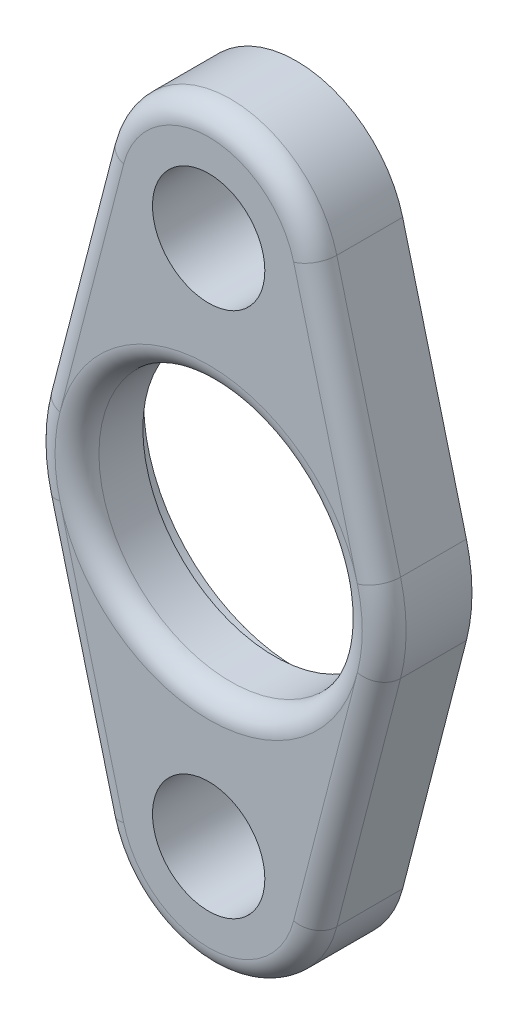
ISO-10303-21;
HEADER;
FILE_DESCRIPTION(('STEP AP214'),'2;1');
FILE_NAME('part.step','',(''),(''),'','','');
FILE_SCHEMA(('AUTOMOTIVE_DESIGN { 1 0 10303 214 1 1 1 1 }'));
ENDSEC;
DATA;
#1=APPLICATION_CONTEXT('core data for automotive mechanical design processes');
#2=APPLICATION_PROTOCOL_DEFINITION('international standard','automotive_design',2000,#1);
#3=PRODUCT_CONTEXT('',#1,'mechanical');
#4=PRODUCT('Part','Part','',(#3));
#5=PRODUCT_RELATED_PRODUCT_CATEGORY('part','',(#4));
#6=PRODUCT_DEFINITION_FORMATION('','',#4);
#7=PRODUCT_DEFINITION_CONTEXT('part definition',#1,'design');
#8=PRODUCT_DEFINITION('design','',#6,#7);
#9=PRODUCT_DEFINITION_SHAPE('','',#8);
#10=(LENGTH_UNIT() NAMED_UNIT(*) SI_UNIT(.MILLI.,.METRE.));
#11=(NAMED_UNIT(*) PLANE_ANGLE_UNIT() SI_UNIT($,.RADIAN.));
#12=(NAMED_UNIT(*) SI_UNIT($,.STERADIAN.) SOLID_ANGLE_UNIT());
#13=UNCERTAINTY_MEASURE_WITH_UNIT(LENGTH_MEASURE(1.E-05),#10,'distance_accuracy_value','');
#14=(GEOMETRIC_REPRESENTATION_CONTEXT(3) GLOBAL_UNCERTAINTY_ASSIGNED_CONTEXT((#13)) GLOBAL_UNIT_ASSIGNED_CONTEXT((#10,
#11,#12)) REPRESENTATION_CONTEXT('',''));
#15=CARTESIAN_POINT('',(0.,0.,0.));
#16=DIRECTION('',(0.,0.,1.));
#17=DIRECTION('',(1.,0.,0.));
#18=AXIS2_PLACEMENT_3D('',#15,#16,#17);
#19=CARTESIAN_POINT('',(0.,-9.525,3.175));
#20=DIRECTION('',(0.,0.,1.));
#21=DIRECTION('',(1.,0.,0.));
#22=AXIS2_PLACEMENT_3D('',#19,#20,#21);
#23=PLANE('',#22);
#24=CARTESIAN_POINT('',(0.,-9.525,3.175));
#25=DIRECTION('',(0.,0.,1.));
#26=DIRECTION('',(1.,0.,0.));
#27=AXIS2_PLACEMENT_3D('',#24,#25,#26);
#28=CIRCLE('',#27,3.175);
#29=CARTESIAN_POINT('',(-3.07418053105214,-10.31875,3.175));
#30=VERTEX_POINT('',#29);
#31=CARTESIAN_POINT('',(3.07418053105214,-10.31875,3.175));
#32=VERTEX_POINT('',#31);
#33=EDGE_CURVE('E215',#30,#32,#28,.T.);
#34=ORIENTED_EDGE('',*,*,#33,.T.);
#35=DIRECTION('',(0.25,0.968245836551854,0.));
#36=VECTOR('',#35,1.);
#37=CARTESIAN_POINT('',(5.37981592934124,-1.3890625,3.175));
#38=LINE('',#37,#36);
#39=CARTESIAN_POINT('',(5.37981592934124,-1.3890625,3.175));
#40=VERTEX_POINT('',#39);
#41=EDGE_CURVE('E212',#32,#40,#38,.T.);
#42=ORIENTED_EDGE('',*,*,#41,.T.);
#43=CARTESIAN_POINT('',(0.,0.,3.175));
#44=DIRECTION('',(0.,0.,1.));
#45=DIRECTION('',(1.,0.,0.));
#46=AXIS2_PLACEMENT_3D('',#43,#44,#45);
#47=CIRCLE('',#46,5.55625);
#48=CARTESIAN_POINT('',(-5.37981592934124,-1.3890625,3.175));
#49=VERTEX_POINT('',#48);
#50=EDGE_CURVE('E208',#40,#49,#47,.F.);
#51=ORIENTED_EDGE('',*,*,#50,.T.);
#52=DIRECTION('',(0.25,-0.968245836551854,0.));
#53=VECTOR('',#52,1.);
#54=CARTESIAN_POINT('',(-3.07418053105214,-10.31875,3.175));
#55=LINE('',#54,#53);
#56=EDGE_CURVE('E209',#49,#30,#55,.T.);
#57=ORIENTED_EDGE('',*,*,#56,.T.);
#58=EDGE_LOOP('',(#34,#42,#51,#57));
#59=FACE_BOUND('',#58,.T.);
#60=CARTESIAN_POINT('',(0.,-9.525,3.175));
#61=DIRECTION('',(0.,0.,1.));
#62=DIRECTION('',(1.,0.,0.));
#63=AXIS2_PLACEMENT_3D('',#60,#61,#62);
#64=CIRCLE('',#63,2.032);
#65=CARTESIAN_POINT('',(2.032,-9.525,3.175));
#66=VERTEX_POINT('',#65);
#67=EDGE_CURVE('E270',#66,#66,#64,.T.);
#68=ORIENTED_EDGE('',*,*,#67,.F.);
#69=EDGE_LOOP('',(#68));
#70=FACE_BOUND('',#69,.T.);
#71=ADVANCED_FACE('F39',(#59,#70),#23,.T.);
#72=CARTESIAN_POINT('',(0.,0.,3.175));
#73=DIRECTION('',(0.,0.,-1.));
#74=DIRECTION('',(-1.,0.,0.));
#75=AXIS2_PLACEMENT_3D('',#72,#73,#74);
#76=CYLINDRICAL_SURFACE('',#75,4.7625);
#77=CARTESIAN_POINT('',(0.,0.,2.38125));
#78=DIRECTION('',(0.,0.,1.));
#79=DIRECTION('',(1.,0.,0.));
#80=AXIS2_PLACEMENT_3D('',#77,#78,#79);
#81=CIRCLE('',#80,4.7625);
#82=CARTESIAN_POINT('',(4.7625,0.,2.38125));
#83=VERTEX_POINT('',#82);
#84=EDGE_CURVE('E48',#83,#83,#81,.T.);
#85=ORIENTED_EDGE('',*,*,#84,.T.);
#86=EDGE_LOOP('',(#85));
#87=FACE_BOUND('',#86,.T.);
#88=CARTESIAN_POINT('',(0.,0.,0.79375));
#89=DIRECTION('',(0.,0.,-1.));
#90=DIRECTION('',(-1.,0.,0.));
#91=AXIS2_PLACEMENT_3D('',#88,#89,#90);
#92=CIRCLE('',#91,4.7625);
#93=CARTESIAN_POINT('',(-4.7625,0.,0.79375));
#94=VERTEX_POINT('',#93);
#95=EDGE_CURVE('E194',#94,#94,#92,.T.);
#96=ORIENTED_EDGE('',*,*,#95,.T.);
#97=EDGE_LOOP('',(#96));
#98=FACE_BOUND('',#97,.T.);
#99=ADVANCED_FACE('F291',(#87,#98),#76,.F.);
#100=CARTESIAN_POINT('',(0.,9.525,3.175));
#101=DIRECTION('',(0.,0.,1.));
#102=DIRECTION('',(1.,0.,0.));
#103=AXIS2_PLACEMENT_3D('',#100,#101,#102);
#104=CIRCLE('',#103,3.175);
#105=CARTESIAN_POINT('',(3.07418053105214,10.31875,3.175));
#106=VERTEX_POINT('',#105);
#107=CARTESIAN_POINT('',(-3.07418053105214,10.31875,3.175));
#108=VERTEX_POINT('',#107);
#109=EDGE_CURVE('E201',#106,#108,#104,.T.);
#110=ORIENTED_EDGE('',*,*,#109,.T.);
#111=DIRECTION('',(-0.25,-0.968245836551854,0.));
#112=VECTOR('',#111,1.);
#113=CARTESIAN_POINT('',(-5.37981592934124,1.3890625,3.175));
#114=LINE('',#113,#112);
#115=CARTESIAN_POINT('',(-5.37981592934124,1.3890625,3.175));
#116=VERTEX_POINT('',#115);
#117=EDGE_CURVE('E202',#108,#116,#114,.T.);
#118=ORIENTED_EDGE('',*,*,#117,.T.);
#119=CARTESIAN_POINT('',(0.,0.,3.175));
#120=DIRECTION('',(0.,0.,1.));
#121=DIRECTION('',(1.,0.,0.));
#122=AXIS2_PLACEMENT_3D('',#119,#120,#121);
#123=CIRCLE('',#122,5.55625);
#124=CARTESIAN_POINT('',(5.37981592934124,1.3890625,3.175));
#125=VERTEX_POINT('',#124);
#126=EDGE_CURVE('E203',#116,#125,#123,.F.);
#127=ORIENTED_EDGE('',*,*,#126,.T.);
#128=DIRECTION('',(-0.25,0.968245836551854,0.));
#129=VECTOR('',#128,1.);
#130=CARTESIAN_POINT('',(3.07418053105214,10.31875,3.175));
#131=LINE('',#130,#129);
#132=EDGE_CURVE('E200',#125,#106,#131,.T.);
#133=ORIENTED_EDGE('',*,*,#132,.T.);
#134=EDGE_LOOP('',(#110,#118,#127,#133));
#135=FACE_BOUND('',#134,.T.);
#136=CARTESIAN_POINT('',(0.,9.525,3.175));
#137=DIRECTION('',(0.,0.,1.));
#138=DIRECTION('',(1.,0.,0.));
#139=AXIS2_PLACEMENT_3D('',#136,#137,#138);
#140=CIRCLE('',#139,2.032);
#141=CARTESIAN_POINT('',(2.032,9.525,3.175));
#142=VERTEX_POINT('',#141);
#143=EDGE_CURVE('E158',#142,#142,#140,.T.);
#144=ORIENTED_EDGE('',*,*,#143,.F.);
#145=EDGE_LOOP('',(#144));
#146=FACE_BOUND('',#145,.T.);
#147=ADVANCED_FACE('F296',(#135,#146),#23,.T.);
#148=CARTESIAN_POINT('',(0.,-9.525,0.));
#149=DIRECTION('',(0.,0.,1.));
#150=DIRECTION('',(1.,0.,0.));
#151=AXIS2_PLACEMENT_3D('',#148,#149,#150);
#152=PLANE('',#151);
#153=CARTESIAN_POINT('',(0.,0.,0.));
#154=DIRECTION('',(0.,0.,-1.));
#155=DIRECTION('',(-1.,0.,0.));
#156=AXIS2_PLACEMENT_3D('',#153,#154,#155);
#157=CIRCLE('',#156,5.5245);
#158=CARTESIAN_POINT('',(-5.5245,0.,0.));
#159=VERTEX_POINT('',#158);
#160=EDGE_CURVE('E258',#159,#159,#157,.T.);
#161=ORIENTED_EDGE('',*,*,#160,.F.);
#162=EDGE_LOOP('',(#161));
#163=FACE_BOUND('',#162,.T.);
#164=CARTESIAN_POINT('',(0.,-9.525,0.));
#165=DIRECTION('',(0.,0.,1.));
#166=DIRECTION('',(1.,0.,0.));
#167=AXIS2_PLACEMENT_3D('',#164,#165,#166);
#168=CIRCLE('',#167,3.96875);
#169=CARTESIAN_POINT('',(-3.84272566381517,-10.5171875,0.));
#170=VERTEX_POINT('',#169);
#171=CARTESIAN_POINT('',(3.84272566381517,-10.5171875,0.));
#172=VERTEX_POINT('',#171);
#173=EDGE_CURVE('E149',#170,#172,#168,.T.);
#174=ORIENTED_EDGE('',*,*,#173,.F.);
#175=DIRECTION('',(0.25,-0.968245836551854,0.));
#176=VECTOR('',#175,1.);
#177=CARTESIAN_POINT('',(-6.14836106210427,-1.5875,0.));
#178=LINE('',#177,#176);
#179=CARTESIAN_POINT('',(-6.14836106210427,-1.5875,0.));
#180=VERTEX_POINT('',#179);
#181=EDGE_CURVE('E180',#180,#170,#178,.T.);
#182=ORIENTED_EDGE('',*,*,#181,.F.);
#183=CARTESIAN_POINT('',(0.,0.,0.));
#184=DIRECTION('',(0.,0.,1.));
#185=DIRECTION('',(1.,0.,0.));
#186=AXIS2_PLACEMENT_3D('',#183,#184,#185);
#187=CIRCLE('',#186,6.35);
#188=CARTESIAN_POINT('',(-6.14836106210428,1.5875,0.));
#189=VERTEX_POINT('',#188);
#190=EDGE_CURVE('E174',#189,#180,#187,.T.);
#191=ORIENTED_EDGE('',*,*,#190,.F.);
#192=DIRECTION('',(-0.25,-0.968245836551854,0.));
#193=VECTOR('',#192,1.);
#194=CARTESIAN_POINT('',(-3.84272566381517,10.5171875,0.));
#195=LINE('',#194,#193);
#196=CARTESIAN_POINT('',(-3.84272566381517,10.5171875,0.));
#197=VERTEX_POINT('',#196);
#198=EDGE_CURVE('E175',#197,#189,#195,.T.);
#199=ORIENTED_EDGE('',*,*,#198,.F.);
#200=CARTESIAN_POINT('',(0.,9.525,0.));
#201=DIRECTION('',(0.,0.,1.));
#202=DIRECTION('',(1.,0.,0.));
#203=AXIS2_PLACEMENT_3D('',#200,#201,#202);
#204=CIRCLE('',#203,3.96875);
#205=CARTESIAN_POINT('',(3.84272566381517,10.5171875,0.));
#206=VERTEX_POINT('',#205);
#207=EDGE_CURVE('E166',#206,#197,#204,.T.);
#208=ORIENTED_EDGE('',*,*,#207,.F.);
#209=DIRECTION('',(-0.25,0.968245836551854,0.));
#210=VECTOR('',#209,1.);
#211=CARTESIAN_POINT('',(6.14836106210428,1.5875,0.));
#212=LINE('',#211,#210);
#213=CARTESIAN_POINT('',(6.14836106210428,1.5875,0.));
#214=VERTEX_POINT('',#213);
#215=EDGE_CURVE('E167',#214,#206,#212,.T.);
#216=ORIENTED_EDGE('',*,*,#215,.F.);
#217=CARTESIAN_POINT('',(0.,0.,0.));
#218=DIRECTION('',(0.,0.,1.));
#219=DIRECTION('',(1.,0.,0.));
#220=AXIS2_PLACEMENT_3D('',#217,#218,#219);
#221=CIRCLE('',#220,6.35);
#222=CARTESIAN_POINT('',(6.14836106210428,-1.5875,0.));
#223=VERTEX_POINT('',#222);
#224=EDGE_CURVE('E155',#223,#214,#221,.T.);
#225=ORIENTED_EDGE('',*,*,#224,.F.);
#226=DIRECTION('',(0.25,0.968245836551854,0.));
#227=VECTOR('',#226,1.);
#228=CARTESIAN_POINT('',(3.84272566381517,-10.5171875,0.));
#229=LINE('',#228,#227);
#230=EDGE_CURVE('E133',#172,#223,#229,.T.);
#231=ORIENTED_EDGE('',*,*,#230,.F.);
#232=EDGE_LOOP('',(#174,#182,#191,#199,#208,#216,#225,#231));
#233=FACE_BOUND('',#232,.T.);
#234=CARTESIAN_POINT('',(0.,9.525,0.));
#235=DIRECTION('',(0.,0.,1.));
#236=DIRECTION('',(1.,0.,0.));
#237=AXIS2_PLACEMENT_3D('',#234,#235,#236);
#238=CIRCLE('',#237,2.032);
#239=CARTESIAN_POINT('',(2.032,9.525,0.));
#240=VERTEX_POINT('',#239);
#241=EDGE_CURVE('E161',#240,#240,#238,.T.);
#242=ORIENTED_EDGE('',*,*,#241,.T.);
#243=EDGE_LOOP('',(#242));
#244=FACE_BOUND('',#243,.T.);
#245=CARTESIAN_POINT('',(0.,-9.525,0.));
#246=DIRECTION('',(0.,0.,1.));
#247=DIRECTION('',(1.,0.,0.));
#248=AXIS2_PLACEMENT_3D('',#245,#246,#247);
#249=CIRCLE('',#248,2.032);
#250=CARTESIAN_POINT('',(2.032,-9.525,0.));
#251=VERTEX_POINT('',#250);
#252=EDGE_CURVE('E193',#251,#251,#249,.T.);
#253=ORIENTED_EDGE('',*,*,#252,.T.);
#254=EDGE_LOOP('',(#253));
#255=FACE_BOUND('',#254,.T.);
#256=ADVANCED_FACE('F148',(#163,#233,#244,#255),#152,.F.);
#257=CARTESIAN_POINT('',(0.,-9.525,3.175));
#258=DIRECTION('',(0.,0.,-1.));
#259=DIRECTION('',(-1.,0.,0.));
#260=AXIS2_PLACEMENT_3D('',#257,#258,#259);
#261=CYLINDRICAL_SURFACE('',#260,3.96875);
#262=DIRECTION('',(0.,0.,-1.));
#263=VECTOR('',#262,1.);
#264=CARTESIAN_POINT('',(3.84272566381517,-10.5171875,3.175));
#265=LINE('',#264,#263);
#266=CARTESIAN_POINT('',(3.84272566381517,-10.5171875,2.38125));
#267=VERTEX_POINT('',#266);
#268=EDGE_CURVE('E128',#267,#172,#265,.T.);
#269=ORIENTED_EDGE('',*,*,#268,.F.);
#270=CARTESIAN_POINT('',(0.,-9.525,2.38125));
#271=DIRECTION('',(0.,0.,1.));
#272=DIRECTION('',(1.,0.,0.));
#273=AXIS2_PLACEMENT_3D('',#270,#271,#272);
#274=CIRCLE('',#273,3.96875);
#275=CARTESIAN_POINT('',(-3.84272566381517,-10.5171875,2.38125));
#276=VERTEX_POINT('',#275);
#277=EDGE_CURVE('E217',#267,#276,#274,.F.);
#278=ORIENTED_EDGE('',*,*,#277,.T.);
#279=DIRECTION('',(0.,0.,-1.));
#280=VECTOR('',#279,1.);
#281=CARTESIAN_POINT('',(-3.84272566381517,-10.5171875,3.175));
#282=LINE('',#281,#280);
#283=EDGE_CURVE('E156',#276,#170,#282,.T.);
#284=ORIENTED_EDGE('',*,*,#283,.T.);
#285=ORIENTED_EDGE('',*,*,#173,.T.);
#286=EDGE_LOOP('',(#269,#278,#284,#285));
#287=FACE_BOUND('',#286,.T.);
#288=ADVANCED_FACE('F152',(#287),#261,.T.);
#289=CARTESIAN_POINT('',(3.84272566381517,-10.5171875,3.175));
#290=DIRECTION('',(-0.968245836551854,0.25,0.));
#291=DIRECTION('',(-0.25,-0.968245836551854,0.));
#292=AXIS2_PLACEMENT_3D('',#289,#290,#291);
#293=PLANE('',#292);
#294=DIRECTION('',(0.,0.,-1.));
#295=VECTOR('',#294,1.);
#296=CARTESIAN_POINT('',(6.14836106210428,-1.5875,3.175));
#297=LINE('',#296,#295);
#298=CARTESIAN_POINT('',(6.14836106210428,-1.5875,2.38125));
#299=VERTEX_POINT('',#298);
#300=EDGE_CURVE('E142',#299,#223,#297,.T.);
#301=ORIENTED_EDGE('',*,*,#300,.F.);
#302=DIRECTION('',(0.25,0.968245836551854,0.));
#303=VECTOR('',#302,1.);
#304=CARTESIAN_POINT('',(3.84272566381517,-10.5171875,2.38125));
#305=LINE('',#304,#303);
#306=EDGE_CURVE('E139',#299,#267,#305,.F.);
#307=ORIENTED_EDGE('',*,*,#306,.T.);
#308=ORIENTED_EDGE('',*,*,#268,.T.);
#309=ORIENTED_EDGE('',*,*,#230,.T.);
#310=EDGE_LOOP('',(#301,#307,#308,#309));
#311=FACE_BOUND('',#310,.T.);
#312=ADVANCED_FACE('F132',(#311),#293,.F.);
#313=CARTESIAN_POINT('',(0.,0.,3.175));
#314=DIRECTION('',(0.,0.,-1.));
#315=DIRECTION('',(-1.,0.,0.));
#316=AXIS2_PLACEMENT_3D('',#313,#314,#315);
#317=CYLINDRICAL_SURFACE('',#316,6.35);
#318=DIRECTION('',(0.,0.,-1.));
#319=VECTOR('',#318,1.);
#320=CARTESIAN_POINT('',(6.14836106210428,1.5875,3.175));
#321=LINE('',#320,#319);
#322=CARTESIAN_POINT('',(6.14836106210428,1.5875,2.38125));
#323=VERTEX_POINT('',#322);
#324=EDGE_CURVE('E188',#323,#214,#321,.T.);
#325=ORIENTED_EDGE('',*,*,#324,.F.);
#326=CARTESIAN_POINT('',(0.,0.,2.38125));
#327=DIRECTION('',(0.,0.,1.));
#328=DIRECTION('',(1.,0.,0.));
#329=AXIS2_PLACEMENT_3D('',#326,#327,#328);
#330=CIRCLE('',#329,6.35);
#331=EDGE_CURVE('E143',#323,#299,#330,.F.);
#332=ORIENTED_EDGE('',*,*,#331,.T.);
#333=ORIENTED_EDGE('',*,*,#300,.T.);
#334=ORIENTED_EDGE('',*,*,#224,.T.);
#335=EDGE_LOOP('',(#325,#332,#333,#334));
#336=FACE_BOUND('',#335,.T.);
#337=ADVANCED_FACE('F331',(#336),#317,.T.);
#338=CARTESIAN_POINT('',(6.14836106210428,1.5875,3.175));
#339=DIRECTION('',(-0.968245836551854,-0.25,0.));
#340=DIRECTION('',(0.25,-0.968245836551854,0.));
#341=AXIS2_PLACEMENT_3D('',#338,#339,#340);
#342=PLANE('',#341);
#343=DIRECTION('',(0.,0.,-1.));
#344=VECTOR('',#343,1.);
#345=CARTESIAN_POINT('',(3.84272566381517,10.5171875,3.175));
#346=LINE('',#345,#344);
#347=CARTESIAN_POINT('',(3.84272566381517,10.5171875,2.38125));
#348=VERTEX_POINT('',#347);
#349=EDGE_CURVE('E190',#348,#206,#346,.T.);
#350=ORIENTED_EDGE('',*,*,#349,.F.);
#351=DIRECTION('',(-0.25,0.968245836551854,0.));
#352=VECTOR('',#351,1.);
#353=CARTESIAN_POINT('',(6.14836106210428,1.5875,2.38125));
#354=LINE('',#353,#352);
#355=EDGE_CURVE('E11',#348,#323,#354,.F.);
#356=ORIENTED_EDGE('',*,*,#355,.T.);
#357=ORIENTED_EDGE('',*,*,#324,.T.);
#358=ORIENTED_EDGE('',*,*,#215,.T.);
#359=EDGE_LOOP('',(#350,#356,#357,#358));
#360=FACE_BOUND('',#359,.T.);
#361=ADVANCED_FACE('F332',(#360),#342,.F.);
#362=CARTESIAN_POINT('',(0.,9.525,3.175));
#363=DIRECTION('',(0.,0.,-1.));
#364=DIRECTION('',(-1.,0.,0.));
#365=AXIS2_PLACEMENT_3D('',#362,#363,#364);
#366=CYLINDRICAL_SURFACE('',#365,3.96875);
#367=DIRECTION('',(0.,0.,-1.));
#368=VECTOR('',#367,1.);
#369=CARTESIAN_POINT('',(-3.84272566381517,10.5171875,3.175));
#370=LINE('',#369,#368);
#371=CARTESIAN_POINT('',(-3.84272566381517,10.5171875,2.38125));
#372=VERTEX_POINT('',#371);
#373=EDGE_CURVE('E183',#372,#197,#370,.T.);
#374=ORIENTED_EDGE('',*,*,#373,.F.);
#375=CARTESIAN_POINT('',(0.,9.525,2.38125));
#376=DIRECTION('',(0.,0.,1.));
#377=DIRECTION('',(1.,0.,0.));
#378=AXIS2_PLACEMENT_3D('',#375,#376,#377);
#379=CIRCLE('',#378,3.96875);
#380=EDGE_CURVE('E57',#372,#348,#379,.F.);
#381=ORIENTED_EDGE('',*,*,#380,.T.);
#382=ORIENTED_EDGE('',*,*,#349,.T.);
#383=ORIENTED_EDGE('',*,*,#207,.T.);
#384=EDGE_LOOP('',(#374,#381,#382,#383));
#385=FACE_BOUND('',#384,.T.);
#386=ADVANCED_FACE('F359',(#385),#366,.T.);
#387=CARTESIAN_POINT('',(-3.84272566381517,10.5171875,3.175));
#388=DIRECTION('',(0.968245836551854,-0.25,0.));
#389=DIRECTION('',(0.25,0.968245836551854,0.));
#390=AXIS2_PLACEMENT_3D('',#387,#388,#389);
#391=PLANE('',#390);
#392=DIRECTION('',(0.,0.,-1.));
#393=VECTOR('',#392,1.);
#394=CARTESIAN_POINT('',(-6.14836106210428,1.5875,3.175));
#395=LINE('',#394,#393);
#396=CARTESIAN_POINT('',(-6.14836106210428,1.5875,2.38125));
#397=VERTEX_POINT('',#396);
#398=EDGE_CURVE('E181',#397,#189,#395,.T.);
#399=ORIENTED_EDGE('',*,*,#398,.F.);
#400=DIRECTION('',(-0.25,-0.968245836551854,0.));
#401=VECTOR('',#400,1.);
#402=CARTESIAN_POINT('',(-3.84272566381517,10.5171875,2.38125));
#403=LINE('',#402,#401);
#404=EDGE_CURVE('E63',#397,#372,#403,.F.);
#405=ORIENTED_EDGE('',*,*,#404,.T.);
#406=ORIENTED_EDGE('',*,*,#373,.T.);
#407=ORIENTED_EDGE('',*,*,#198,.T.);
#408=EDGE_LOOP('',(#399,#405,#406,#407));
#409=FACE_BOUND('',#408,.T.);
#410=ADVANCED_FACE('F352',(#409),#391,.F.);
#411=CARTESIAN_POINT('',(0.,0.,3.175));
#412=DIRECTION('',(0.,0.,-1.));
#413=DIRECTION('',(-1.,0.,0.));
#414=AXIS2_PLACEMENT_3D('',#411,#412,#413);
#415=CYLINDRICAL_SURFACE('',#414,6.35);
#416=DIRECTION('',(0.,0.,-1.));
#417=VECTOR('',#416,1.);
#418=CARTESIAN_POINT('',(-6.14836106210427,-1.5875,3.175));
#419=LINE('',#418,#417);
#420=CARTESIAN_POINT('',(-6.14836106210427,-1.5875,2.38125));
#421=VERTEX_POINT('',#420);
#422=EDGE_CURVE('E182',#421,#180,#419,.T.);
#423=ORIENTED_EDGE('',*,*,#422,.F.);
#424=CARTESIAN_POINT('',(0.,0.,2.38125));
#425=DIRECTION('',(0.,0.,1.));
#426=DIRECTION('',(1.,0.,0.));
#427=AXIS2_PLACEMENT_3D('',#424,#425,#426);
#428=CIRCLE('',#427,6.35);
#429=EDGE_CURVE('E225',#421,#397,#428,.F.);
#430=ORIENTED_EDGE('',*,*,#429,.T.);
#431=ORIENTED_EDGE('',*,*,#398,.T.);
#432=ORIENTED_EDGE('',*,*,#190,.T.);
#433=EDGE_LOOP('',(#423,#430,#431,#432));
#434=FACE_BOUND('',#433,.T.);
#435=ADVANCED_FACE('F355',(#434),#415,.T.);
#436=CARTESIAN_POINT('',(-6.14836106210427,-1.5875,3.175));
#437=DIRECTION('',(0.968245836551854,0.25,0.));
#438=DIRECTION('',(-0.25,0.968245836551854,0.));
#439=AXIS2_PLACEMENT_3D('',#436,#437,#438);
#440=PLANE('',#439);
#441=ORIENTED_EDGE('',*,*,#283,.F.);
#442=DIRECTION('',(0.25,-0.968245836551854,0.));
#443=VECTOR('',#442,1.);
#444=CARTESIAN_POINT('',(-6.14836106210427,-1.5875,2.38125));
#445=LINE('',#444,#443);
#446=EDGE_CURVE('E219',#276,#421,#445,.F.);
#447=ORIENTED_EDGE('',*,*,#446,.T.);
#448=ORIENTED_EDGE('',*,*,#422,.T.);
#449=ORIENTED_EDGE('',*,*,#181,.T.);
#450=EDGE_LOOP('',(#441,#447,#448,#449));
#451=FACE_BOUND('',#450,.T.);
#452=ADVANCED_FACE('F290',(#451),#440,.F.);
#453=CARTESIAN_POINT('',(0.,9.525,3.175));
#454=DIRECTION('',(0.,0.,-1.));
#455=DIRECTION('',(-1.,0.,0.));
#456=AXIS2_PLACEMENT_3D('',#453,#454,#455);
#457=CYLINDRICAL_SURFACE('',#456,2.032);
#458=ORIENTED_EDGE('',*,*,#143,.T.);
#459=EDGE_LOOP('',(#458));
#460=FACE_BOUND('',#459,.T.);
#461=ORIENTED_EDGE('',*,*,#241,.F.);
#462=EDGE_LOOP('',(#461));
#463=FACE_BOUND('',#462,.T.);
#464=ADVANCED_FACE('F280',(#460,#463),#457,.F.);
#465=CARTESIAN_POINT('',(0.,-9.525,3.175));
#466=DIRECTION('',(0.,0.,-1.));
#467=DIRECTION('',(-1.,0.,0.));
#468=AXIS2_PLACEMENT_3D('',#465,#466,#467);
#469=CYLINDRICAL_SURFACE('',#468,2.032);
#470=ORIENTED_EDGE('',*,*,#67,.T.);
#471=EDGE_LOOP('',(#470));
#472=FACE_BOUND('',#471,.T.);
#473=ORIENTED_EDGE('',*,*,#252,.F.);
#474=EDGE_LOOP('',(#473));
#475=FACE_BOUND('',#474,.T.);
#476=ADVANCED_FACE('F273',(#472,#475),#469,.F.);
#477=CARTESIAN_POINT('',(0.,0.,0.79375));
#478=DIRECTION('',(0.,0.,-1.));
#479=DIRECTION('',(-1.,0.,0.));
#480=AXIS2_PLACEMENT_3D('',#477,#478,#479);
#481=CYLINDRICAL_SURFACE('',#480,5.5245);
#482=CARTESIAN_POINT('',(0.,0.,0.79375));
#483=DIRECTION('',(0.,0.,-1.));
#484=DIRECTION('',(-1.,0.,0.));
#485=AXIS2_PLACEMENT_3D('',#482,#483,#484);
#486=CIRCLE('',#485,5.5245);
#487=CARTESIAN_POINT('',(-5.5245,0.,0.79375));
#488=VERTEX_POINT('',#487);
#489=EDGE_CURVE('E198',#488,#488,#486,.T.);
#490=ORIENTED_EDGE('',*,*,#489,.F.);
#491=EDGE_LOOP('',(#490));
#492=FACE_BOUND('',#491,.T.);
#493=ORIENTED_EDGE('',*,*,#160,.T.);
#494=EDGE_LOOP('',(#493));
#495=FACE_BOUND('',#494,.T.);
#496=ADVANCED_FACE('F277',(#492,#495),#481,.F.);
#497=CARTESIAN_POINT('',(0.,0.,0.79375));
#498=DIRECTION('',(0.,0.,-1.));
#499=DIRECTION('',(-1.,0.,0.));
#500=AXIS2_PLACEMENT_3D('',#497,#498,#499);
#501=PLANE('',#500);
#502=ORIENTED_EDGE('',*,*,#95,.F.);
#503=EDGE_LOOP('',(#502));
#504=FACE_BOUND('',#503,.T.);
#505=ORIENTED_EDGE('',*,*,#489,.T.);
#506=EDGE_LOOP('',(#505));
#507=FACE_BOUND('',#506,.T.);
#508=ADVANCED_FACE('F284',(#504,#507),#501,.T.);
#509=CARTESIAN_POINT('',(-3.07418053105214,-10.31875,2.38125));
#510=DIRECTION('',(-0.25,0.968245836551854,0.));
#511=DIRECTION('',(-0.968245836551854,-0.25,0.));
#512=AXIS2_PLACEMENT_3D('',#509,#510,#511);
#513=CYLINDRICAL_SURFACE('',#512,0.79375);
#514=CARTESIAN_POINT('',(-5.37981592934124,-1.3890625,2.38125));
#515=DIRECTION('',(-0.25,0.968245836551854,0.));
#516=DIRECTION('',(-0.968245836551854,-0.25,0.));
#517=AXIS2_PLACEMENT_3D('',#514,#515,#516);
#518=CIRCLE('',#517,0.79375);
#519=EDGE_CURVE('E246',#421,#49,#518,.T.);
#520=ORIENTED_EDGE('',*,*,#519,.F.);
#521=ORIENTED_EDGE('',*,*,#446,.F.);
#522=CARTESIAN_POINT('',(-3.07418053105214,-10.31875,2.38125));
#523=DIRECTION('',(0.250000000000001,-0.968245836551854,0.));
#524=DIRECTION('',(0.968245836551854,0.250000000000001,0.));
#525=AXIS2_PLACEMENT_3D('',#522,#523,#524);
#526=CIRCLE('',#525,0.79375);
#527=EDGE_CURVE('E43',#30,#276,#526,.T.);
#528=ORIENTED_EDGE('',*,*,#527,.F.);
#529=ORIENTED_EDGE('',*,*,#56,.F.);
#530=EDGE_LOOP('',(#520,#521,#528,#529));
#531=FACE_BOUND('',#530,.T.);
#532=ADVANCED_FACE('F41',(#531),#513,.T.);
#533=CARTESIAN_POINT('',(-7.68545132763035,-7.540625,2.38125));
#534=DIRECTION('',(0.25,0.968245836551854,0.));
#535=DIRECTION('',(-0.968245836551854,0.25,0.));
#536=AXIS2_PLACEMENT_3D('',#533,#534,#535);
#537=CYLINDRICAL_SURFACE('',#536,0.79375);
#538=CARTESIAN_POINT('',(-3.07418053105214,10.31875,2.38125));
#539=DIRECTION('',(0.250000000000001,0.968245836551854,0.));
#540=DIRECTION('',(-0.968245836551854,0.250000000000001,0.));
#541=AXIS2_PLACEMENT_3D('',#538,#539,#540);
#542=CIRCLE('',#541,0.79375);
#543=EDGE_CURVE('E243',#372,#108,#542,.T.);
#544=ORIENTED_EDGE('',*,*,#543,.F.);
#545=ORIENTED_EDGE('',*,*,#404,.F.);
#546=CARTESIAN_POINT('',(-5.37981592934124,1.3890625,2.38125));
#547=DIRECTION('',(-0.25,-0.968245836551854,0.));
#548=DIRECTION('',(0.968245836551854,-0.25,0.));
#549=AXIS2_PLACEMENT_3D('',#546,#547,#548);
#550=CIRCLE('',#549,0.79375);
#551=EDGE_CURVE('E249',#116,#397,#550,.T.);
#552=ORIENTED_EDGE('',*,*,#551,.F.);
#553=ORIENTED_EDGE('',*,*,#117,.F.);
#554=EDGE_LOOP('',(#544,#545,#552,#553));
#555=FACE_BOUND('',#554,.T.);
#556=ADVANCED_FACE('F323',(#555),#537,.T.);
#557=CARTESIAN_POINT('',(0.,-9.525,2.38125));
#558=DIRECTION('',(0.,0.,1.));
#559=DIRECTION('',(1.,0.,0.));
#560=AXIS2_PLACEMENT_3D('',#557,#558,#559);
#561=TOROIDAL_SURFACE('',#560,3.175,0.79375);
#562=ORIENTED_EDGE('',*,*,#527,.T.);
#563=ORIENTED_EDGE('',*,*,#277,.F.);
#564=CARTESIAN_POINT('',(3.07418053105214,-10.31875,2.38125));
#565=DIRECTION('',(0.250000000000001,0.968245836551854,0.));
#566=DIRECTION('',(-0.968245836551854,0.250000000000001,0.));
#567=AXIS2_PLACEMENT_3D('',#564,#565,#566);
#568=CIRCLE('',#567,0.79375);
#569=EDGE_CURVE('E241',#32,#267,#568,.T.);
#570=ORIENTED_EDGE('',*,*,#569,.F.);
#571=ORIENTED_EDGE('',*,*,#33,.F.);
#572=EDGE_LOOP('',(#562,#563,#570,#571));
#573=FACE_BOUND('',#572,.T.);
#574=ADVANCED_FACE('F341',(#573),#561,.T.);
#575=CARTESIAN_POINT('',(0.,0.,2.38125));
#576=DIRECTION('',(0.,0.,1.));
#577=DIRECTION('',(1.,0.,0.));
#578=AXIS2_PLACEMENT_3D('',#575,#576,#577);
#579=TOROIDAL_SURFACE('',#578,5.55625,0.79375);
#580=ORIENTED_EDGE('',*,*,#429,.F.);
#581=ORIENTED_EDGE('',*,*,#519,.T.);
#582=CARTESIAN_POINT('',(0.,0.,3.175));
#583=DIRECTION('',(0.,0.,1.));
#584=DIRECTION('',(1.,0.,0.));
#585=AXIS2_PLACEMENT_3D('',#582,#583,#584);
#586=CIRCLE('',#585,5.55625);
#587=EDGE_CURVE('E236',#116,#49,#586,.T.);
#588=ORIENTED_EDGE('',*,*,#587,.F.);
#589=ORIENTED_EDGE('',*,*,#551,.T.);
#590=EDGE_LOOP('',(#580,#581,#588,#589));
#591=FACE_BOUND('',#590,.T.);
#592=ADVANCED_FACE('F348',(#591),#579,.T.);
#593=CARTESIAN_POINT('',(0.,9.525,2.38125));
#594=DIRECTION('',(0.,0.,1.));
#595=DIRECTION('',(1.,0.,0.));
#596=AXIS2_PLACEMENT_3D('',#593,#594,#595);
#597=TOROIDAL_SURFACE('',#596,3.175,0.79375);
#598=ORIENTED_EDGE('',*,*,#543,.T.);
#599=ORIENTED_EDGE('',*,*,#109,.F.);
#600=CARTESIAN_POINT('',(3.07418053105214,10.31875,2.38125));
#601=DIRECTION('',(0.250000000000001,-0.968245836551854,0.));
#602=DIRECTION('',(0.968245836551854,0.250000000000001,0.));
#603=AXIS2_PLACEMENT_3D('',#600,#601,#602);
#604=CIRCLE('',#603,0.79375);
#605=EDGE_CURVE('E233',#348,#106,#604,.T.);
#606=ORIENTED_EDGE('',*,*,#605,.F.);
#607=ORIENTED_EDGE('',*,*,#380,.F.);
#608=EDGE_LOOP('',(#598,#599,#606,#607));
#609=FACE_BOUND('',#608,.T.);
#610=ADVANCED_FACE('F322',(#609),#597,.T.);
#611=CARTESIAN_POINT('',(3.07418053105214,-10.31875,2.38125));
#612=DIRECTION('',(-0.25,-0.968245836551854,0.));
#613=DIRECTION('',(0.968245836551854,-0.25,0.));
#614=AXIS2_PLACEMENT_3D('',#611,#612,#613);
#615=CYLINDRICAL_SURFACE('',#614,0.79375);
#616=ORIENTED_EDGE('',*,*,#569,.T.);
#617=ORIENTED_EDGE('',*,*,#306,.F.);
#618=CARTESIAN_POINT('',(5.37981592934124,-1.3890625,2.38125));
#619=DIRECTION('',(0.25,0.968245836551854,0.));
#620=DIRECTION('',(-0.968245836551854,0.25,0.));
#621=AXIS2_PLACEMENT_3D('',#618,#619,#620);
#622=CIRCLE('',#621,0.79375);
#623=EDGE_CURVE('E235',#40,#299,#622,.T.);
#624=ORIENTED_EDGE('',*,*,#623,.F.);
#625=ORIENTED_EDGE('',*,*,#41,.F.);
#626=EDGE_LOOP('',(#616,#617,#624,#625));
#627=FACE_BOUND('',#626,.T.);
#628=ADVANCED_FACE('F344',(#627),#615,.T.);
#629=CARTESIAN_POINT('',(0.,0.,2.38125));
#630=DIRECTION('',(0.,0.,1.));
#631=DIRECTION('',(1.,0.,0.));
#632=AXIS2_PLACEMENT_3D('',#629,#630,#631);
#633=TOROIDAL_SURFACE('',#632,5.55625,0.79375);
#634=ORIENTED_EDGE('',*,*,#84,.F.);
#635=EDGE_LOOP('',(#634));
#636=FACE_BOUND('',#635,.T.);
#637=ORIENTED_EDGE('',*,*,#587,.T.);
#638=ORIENTED_EDGE('',*,*,#50,.F.);
#639=CARTESIAN_POINT('',(0.,0.,3.175));
#640=DIRECTION('',(0.,0.,1.));
#641=DIRECTION('',(1.,0.,0.));
#642=AXIS2_PLACEMENT_3D('',#639,#640,#641);
#643=CIRCLE('',#642,5.55625);
#644=EDGE_CURVE('E232',#125,#40,#643,.F.);
#645=ORIENTED_EDGE('',*,*,#644,.F.);
#646=ORIENTED_EDGE('',*,*,#126,.F.);
#647=EDGE_LOOP('',(#637,#638,#645,#646));
#648=FACE_BOUND('',#647,.T.);
#649=ADVANCED_FACE('F380',(#636,#648),#633,.T.);
#650=CARTESIAN_POINT('',(7.68545132763034,-7.540625,2.38125));
#651=DIRECTION('',(0.25,-0.968245836551854,0.));
#652=DIRECTION('',(0.968245836551854,0.25,0.));
#653=AXIS2_PLACEMENT_3D('',#650,#651,#652);
#654=CYLINDRICAL_SURFACE('',#653,0.79375);
#655=ORIENTED_EDGE('',*,*,#605,.T.);
#656=ORIENTED_EDGE('',*,*,#132,.F.);
#657=CARTESIAN_POINT('',(5.37981592934124,1.3890625,2.38125));
#658=DIRECTION('',(0.25,-0.968245836551854,0.));
#659=DIRECTION('',(0.968245836551854,0.25,0.));
#660=AXIS2_PLACEMENT_3D('',#657,#658,#659);
#661=CIRCLE('',#660,0.79375);
#662=EDGE_CURVE('E227',#323,#125,#661,.T.);
#663=ORIENTED_EDGE('',*,*,#662,.F.);
#664=ORIENTED_EDGE('',*,*,#355,.F.);
#665=EDGE_LOOP('',(#655,#656,#663,#664));
#666=FACE_BOUND('',#665,.T.);
#667=ADVANCED_FACE('F327',(#666),#654,.T.);
#668=CARTESIAN_POINT('',(0.,0.,2.38125));
#669=DIRECTION('',(0.,0.,1.));
#670=DIRECTION('',(1.,0.,0.));
#671=AXIS2_PLACEMENT_3D('',#668,#669,#670);
#672=TOROIDAL_SURFACE('',#671,5.55625,0.79375);
#673=ORIENTED_EDGE('',*,*,#623,.T.);
#674=ORIENTED_EDGE('',*,*,#331,.F.);
#675=ORIENTED_EDGE('',*,*,#662,.T.);
#676=ORIENTED_EDGE('',*,*,#644,.T.);
#677=EDGE_LOOP('',(#673,#674,#675,#676));
#678=FACE_BOUND('',#677,.T.);
#679=ADVANCED_FACE('F336',(#678),#672,.T.);
#680=CLOSED_SHELL('',(#71,#99,#147,#256,#288,#312,#337,#361,#386,#410,#435,#452,#464,#476,#496,
#508,#532,#556,#574,#592,#610,#628,#649,#667,#679));
#681=MANIFOLD_SOLID_BREP('B2',#680);
#682=ADVANCED_BREP_SHAPE_REPRESENTATION('',(#18,#681),#14);
#683=SHAPE_DEFINITION_REPRESENTATION(#9,#682);
ENDSEC;
END-ISO-10303-21;
